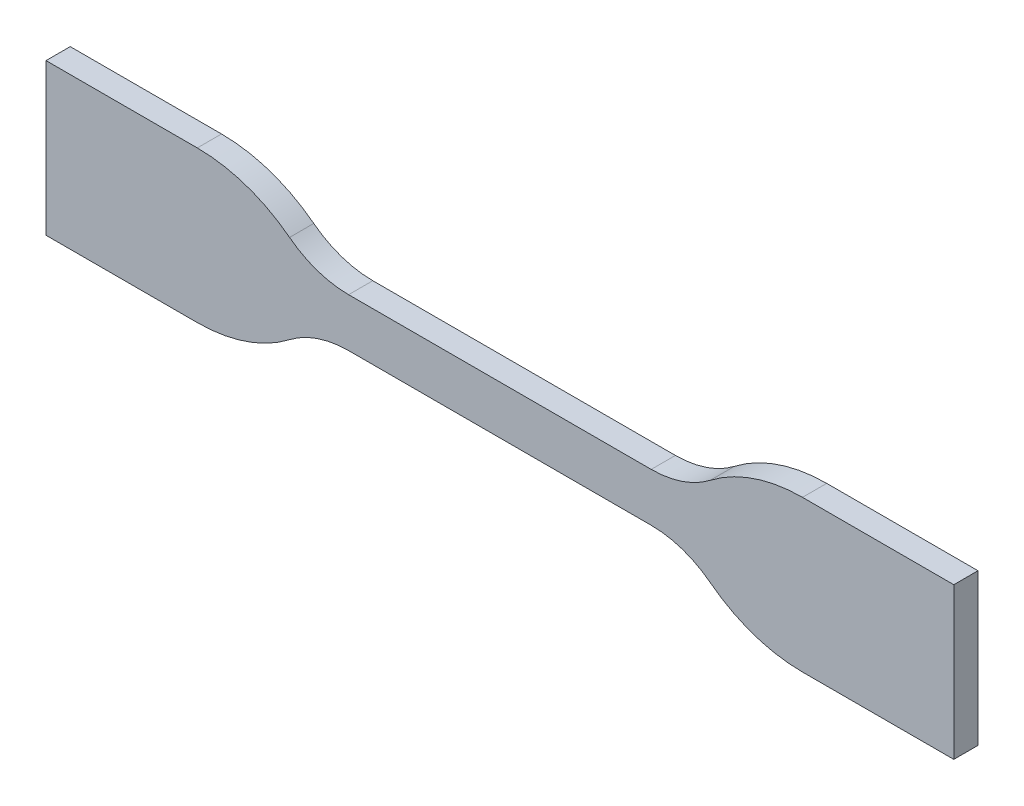
ISO-10303-21;
HEADER;
FILE_DESCRIPTION(('STEP AP214'),'2;1');
FILE_NAME('part.step','',(''),(''),'','','');
FILE_SCHEMA(('AUTOMOTIVE_DESIGN { 1 0 10303 214 1 1 1 1 }'));
ENDSEC;
DATA;
#1=APPLICATION_CONTEXT('core data for automotive mechanical design processes');
#2=APPLICATION_PROTOCOL_DEFINITION('international standard','automotive_design',2000,#1);
#3=PRODUCT_CONTEXT('',#1,'mechanical');
#4=PRODUCT('Part','Part','',(#3));
#5=PRODUCT_RELATED_PRODUCT_CATEGORY('part','',(#4));
#6=PRODUCT_DEFINITION_FORMATION('','',#4);
#7=PRODUCT_DEFINITION_CONTEXT('part definition',#1,'design');
#8=PRODUCT_DEFINITION('design','',#6,#7);
#9=PRODUCT_DEFINITION_SHAPE('','',#8);
#10=(LENGTH_UNIT() NAMED_UNIT(*) SI_UNIT(.MILLI.,.METRE.));
#11=(NAMED_UNIT(*) PLANE_ANGLE_UNIT() SI_UNIT($,.RADIAN.));
#12=(NAMED_UNIT(*) SI_UNIT($,.STERADIAN.) SOLID_ANGLE_UNIT());
#13=UNCERTAINTY_MEASURE_WITH_UNIT(LENGTH_MEASURE(1.E-05),#10,'distance_accuracy_value','');
#14=(GEOMETRIC_REPRESENTATION_CONTEXT(3) GLOBAL_UNCERTAINTY_ASSIGNED_CONTEXT((#13)) GLOBAL_UNIT_ASSIGNED_CONTEXT((#10,
#11,#12)) REPRESENTATION_CONTEXT('',''));
#15=CARTESIAN_POINT('',(0.,0.,0.));
#16=DIRECTION('',(0.,0.,1.));
#17=DIRECTION('',(1.,0.,0.));
#18=AXIS2_PLACEMENT_3D('',#15,#16,#17);
#19=CARTESIAN_POINT('',(12.5,10.0033529411765,2.));
#20=DIRECTION('',(0.,0.,-1.));
#21=DIRECTION('',(-1.,0.,0.));
#22=AXIS2_PLACEMENT_3D('',#19,#20,#21);
#23=CYLINDRICAL_SURFACE('',#22,8.00335294117646);
#24=CARTESIAN_POINT('',(12.5,10.0033529411765,0.));
#25=DIRECTION('',(0.,0.,-1.));
#26=DIRECTION('',(1.,0.,0.));
#27=AXIS2_PLACEMENT_3D('',#24,#25,#26);
#28=CIRCLE('',#27,8.00335294117646);
#29=CARTESIAN_POINT('',(17.3783434922911,3.65863678737899,0.));
#30=VERTEX_POINT('',#29);
#31=CARTESIAN_POINT('',(12.5,1.99999999999999,0.));
#32=VERTEX_POINT('',#31);
#33=EDGE_CURVE('E194',#30,#32,#28,.T.);
#34=ORIENTED_EDGE('',*,*,#33,.T.);
#35=DIRECTION('',(0.,0.,-1.));
#36=VECTOR('',#35,1.);
#37=CARTESIAN_POINT('',(12.5,1.99999999999999,2.));
#38=LINE('',#37,#36);
#39=CARTESIAN_POINT('',(12.5,1.99999999999999,2.));
#40=VERTEX_POINT('',#39);
#41=EDGE_CURVE('E11',#40,#32,#38,.T.);
#42=ORIENTED_EDGE('',*,*,#41,.F.);
#43=CARTESIAN_POINT('',(12.5,10.0033529411765,2.));
#44=DIRECTION('',(0.,0.,-1.));
#45=DIRECTION('',(1.,0.,0.));
#46=AXIS2_PLACEMENT_3D('',#43,#44,#45);
#47=CIRCLE('',#46,8.00335294117646);
#48=CARTESIAN_POINT('',(17.3783434922911,3.65863678737899,2.));
#49=VERTEX_POINT('',#48);
#50=EDGE_CURVE('E240',#49,#40,#47,.T.);
#51=ORIENTED_EDGE('',*,*,#50,.F.);
#52=DIRECTION('',(0.,0.,-1.));
#53=VECTOR('',#52,1.);
#54=CARTESIAN_POINT('',(17.3783434922911,3.65863678737899,2.));
#55=LINE('',#54,#53);
#56=EDGE_CURVE('E190',#49,#30,#55,.T.);
#57=ORIENTED_EDGE('',*,*,#56,.T.);
#58=EDGE_LOOP('',(#34,#42,#51,#57));
#59=FACE_BOUND('',#58,.T.);
#60=ADVANCED_FACE('F44',(#59),#23,.F.);
#61=CARTESIAN_POINT('',(-12.5,2.,2.));
#62=DIRECTION('',(0.,-1.,0.));
#63=DIRECTION('',(1.,0.,0.));
#64=AXIS2_PLACEMENT_3D('',#61,#62,#63);
#65=PLANE('',#64);
#66=DIRECTION('',(-1.,0.,0.));
#67=VECTOR('',#66,1.);
#68=CARTESIAN_POINT('',(-12.5,2.,0.));
#69=LINE('',#68,#67);
#70=CARTESIAN_POINT('',(-12.5,2.,0.));
#71=VERTEX_POINT('',#70);
#72=EDGE_CURVE('E198',#32,#71,#69,.T.);
#73=ORIENTED_EDGE('',*,*,#72,.T.);
#74=DIRECTION('',(0.,0.,-1.));
#75=VECTOR('',#74,1.);
#76=CARTESIAN_POINT('',(-12.5,2.,2.));
#77=LINE('',#76,#75);
#78=CARTESIAN_POINT('',(-12.5,2.,2.));
#79=VERTEX_POINT('',#78);
#80=EDGE_CURVE('E53',#79,#71,#77,.T.);
#81=ORIENTED_EDGE('',*,*,#80,.F.);
#82=DIRECTION('',(-1.,0.,0.));
#83=VECTOR('',#82,1.);
#84=CARTESIAN_POINT('',(-12.5,2.,2.));
#85=LINE('',#84,#83);
#86=EDGE_CURVE('E128',#40,#79,#85,.T.);
#87=ORIENTED_EDGE('',*,*,#86,.F.);
#88=ORIENTED_EDGE('',*,*,#41,.T.);
#89=EDGE_LOOP('',(#73,#81,#87,#88));
#90=FACE_BOUND('',#89,.T.);
#91=ADVANCED_FACE('F373',(#90),#65,.F.);
#92=CARTESIAN_POINT('',(-12.5,10.0033529411765,2.));
#93=DIRECTION('',(0.,0.,-1.));
#94=DIRECTION('',(-1.,0.,0.));
#95=AXIS2_PLACEMENT_3D('',#92,#93,#94);
#96=CYLINDRICAL_SURFACE('',#95,8.00335294117646);
#97=CARTESIAN_POINT('',(-12.5,10.0033529411765,0.));
#98=DIRECTION('',(0.,0.,-1.));
#99=DIRECTION('',(-1.,0.,0.));
#100=AXIS2_PLACEMENT_3D('',#97,#98,#99);
#101=CIRCLE('',#100,8.00335294117646);
#102=CARTESIAN_POINT('',(-17.3783434922911,3.65863678737899,0.));
#103=VERTEX_POINT('',#102);
#104=EDGE_CURVE('E201',#71,#103,#101,.T.);
#105=ORIENTED_EDGE('',*,*,#104,.T.);
#106=DIRECTION('',(0.,0.,-1.));
#107=VECTOR('',#106,1.);
#108=CARTESIAN_POINT('',(-17.3783434922911,3.65863678737899,2.));
#109=LINE('',#108,#107);
#110=CARTESIAN_POINT('',(-17.3783434922911,3.65863678737899,2.));
#111=VERTEX_POINT('',#110);
#112=EDGE_CURVE('E283',#111,#103,#109,.T.);
#113=ORIENTED_EDGE('',*,*,#112,.F.);
#114=CARTESIAN_POINT('',(-12.5,10.0033529411765,2.));
#115=DIRECTION('',(0.,0.,-1.));
#116=DIRECTION('',(-1.,0.,0.));
#117=AXIS2_PLACEMENT_3D('',#114,#115,#116);
#118=CIRCLE('',#117,8.00335294117646);
#119=EDGE_CURVE('E294',#79,#111,#118,.T.);
#120=ORIENTED_EDGE('',*,*,#119,.F.);
#121=ORIENTED_EDGE('',*,*,#80,.T.);
#122=EDGE_LOOP('',(#105,#113,#120,#121));
#123=FACE_BOUND('',#122,.T.);
#124=ADVANCED_FACE('F292',(#123),#96,.F.);
#125=CARTESIAN_POINT('',(-25.,-6.254,2.));
#126=DIRECTION('',(0.,0.,-1.));
#127=DIRECTION('',(-1.,0.,0.));
#128=AXIS2_PLACEMENT_3D('',#125,#126,#127);
#129=CYLINDRICAL_SURFACE('',#128,12.504);
#130=CARTESIAN_POINT('',(-25.,-6.254,0.));
#131=DIRECTION('',(0.,0.,1.));
#132=DIRECTION('',(-1.,0.,0.));
#133=AXIS2_PLACEMENT_3D('',#130,#131,#132);
#134=CIRCLE('',#133,12.504);
#135=CARTESIAN_POINT('',(-25.,6.25,0.));
#136=VERTEX_POINT('',#135);
#137=EDGE_CURVE('E204',#103,#136,#134,.T.);
#138=ORIENTED_EDGE('',*,*,#137,.T.);
#139=DIRECTION('',(0.,0.,-1.));
#140=VECTOR('',#139,1.);
#141=CARTESIAN_POINT('',(-25.,6.25,2.));
#142=LINE('',#141,#140);
#143=CARTESIAN_POINT('',(-25.,6.25,2.));
#144=VERTEX_POINT('',#143);
#145=EDGE_CURVE('E279',#144,#136,#142,.T.);
#146=ORIENTED_EDGE('',*,*,#145,.F.);
#147=CARTESIAN_POINT('',(-25.,-6.254,2.));
#148=DIRECTION('',(0.,0.,1.));
#149=DIRECTION('',(-1.,0.,0.));
#150=AXIS2_PLACEMENT_3D('',#147,#148,#149);
#151=CIRCLE('',#150,12.504);
#152=EDGE_CURVE('E313',#111,#144,#151,.T.);
#153=ORIENTED_EDGE('',*,*,#152,.F.);
#154=ORIENTED_EDGE('',*,*,#112,.T.);
#155=EDGE_LOOP('',(#138,#146,#153,#154));
#156=FACE_BOUND('',#155,.T.);
#157=ADVANCED_FACE('F303',(#156),#129,.T.);
#158=CARTESIAN_POINT('',(-25.,6.25,2.));
#159=DIRECTION('',(0.,-1.,0.));
#160=DIRECTION('',(0.,0.,-1.));
#161=AXIS2_PLACEMENT_3D('',#158,#159,#160);
#162=PLANE('',#161);
#163=DIRECTION('',(-1.,0.,0.));
#164=VECTOR('',#163,1.);
#165=CARTESIAN_POINT('',(-25.,6.25,0.));
#166=LINE('',#165,#164);
#167=CARTESIAN_POINT('',(-37.5,6.25,0.));
#168=VERTEX_POINT('',#167);
#169=EDGE_CURVE('E207',#136,#168,#166,.T.);
#170=ORIENTED_EDGE('',*,*,#169,.T.);
#171=DIRECTION('',(0.,0.,-1.));
#172=VECTOR('',#171,1.);
#173=CARTESIAN_POINT('',(-37.5,6.25,2.));
#174=LINE('',#173,#172);
#175=CARTESIAN_POINT('',(-37.5,6.25,2.));
#176=VERTEX_POINT('',#175);
#177=EDGE_CURVE('E275',#176,#168,#174,.T.);
#178=ORIENTED_EDGE('',*,*,#177,.F.);
#179=DIRECTION('',(-1.,0.,0.));
#180=VECTOR('',#179,1.);
#181=CARTESIAN_POINT('',(-25.,6.25,2.));
#182=LINE('',#181,#180);
#183=EDGE_CURVE('E309',#144,#176,#182,.T.);
#184=ORIENTED_EDGE('',*,*,#183,.F.);
#185=ORIENTED_EDGE('',*,*,#145,.T.);
#186=EDGE_LOOP('',(#170,#178,#184,#185));
#187=FACE_BOUND('',#186,.T.);
#188=ADVANCED_FACE('F307',(#187),#162,.F.);
#189=CARTESIAN_POINT('',(-37.5,6.25,2.));
#190=DIRECTION('',(1.,0.,0.));
#191=DIRECTION('',(0.,0.,-1.));
#192=AXIS2_PLACEMENT_3D('',#189,#190,#191);
#193=PLANE('',#192);
#194=DIRECTION('',(0.,-1.,0.));
#195=VECTOR('',#194,1.);
#196=CARTESIAN_POINT('',(-37.5,6.25,0.));
#197=LINE('',#196,#195);
#198=CARTESIAN_POINT('',(-37.5,-6.25,0.));
#199=VERTEX_POINT('',#198);
#200=EDGE_CURVE('E210',#168,#199,#197,.T.);
#201=ORIENTED_EDGE('',*,*,#200,.T.);
#202=DIRECTION('',(0.,0.,-1.));
#203=VECTOR('',#202,1.);
#204=CARTESIAN_POINT('',(-37.5,-6.25,2.));
#205=LINE('',#204,#203);
#206=CARTESIAN_POINT('',(-37.5,-6.25,2.));
#207=VERTEX_POINT('',#206);
#208=EDGE_CURVE('E271',#207,#199,#205,.T.);
#209=ORIENTED_EDGE('',*,*,#208,.F.);
#210=DIRECTION('',(0.,-1.,0.));
#211=VECTOR('',#210,1.);
#212=CARTESIAN_POINT('',(-37.5,6.25,2.));
#213=LINE('',#212,#211);
#214=EDGE_CURVE('E312',#176,#207,#213,.T.);
#215=ORIENTED_EDGE('',*,*,#214,.F.);
#216=ORIENTED_EDGE('',*,*,#177,.T.);
#217=EDGE_LOOP('',(#201,#209,#215,#216));
#218=FACE_BOUND('',#217,.T.);
#219=ADVANCED_FACE('F386',(#218),#193,.F.);
#220=CARTESIAN_POINT('',(-25.,-6.25,2.));
#221=DIRECTION('',(0.,1.,0.));
#222=DIRECTION('',(0.,0.,1.));
#223=AXIS2_PLACEMENT_3D('',#220,#221,#222);
#224=PLANE('',#223);
#225=DIRECTION('',(1.,0.,0.));
#226=VECTOR('',#225,1.);
#227=CARTESIAN_POINT('',(-25.,-6.25,0.));
#228=LINE('',#227,#226);
#229=CARTESIAN_POINT('',(-25.,-6.25,0.));
#230=VERTEX_POINT('',#229);
#231=EDGE_CURVE('E213',#199,#230,#228,.T.);
#232=ORIENTED_EDGE('',*,*,#231,.T.);
#233=DIRECTION('',(0.,0.,-1.));
#234=VECTOR('',#233,1.);
#235=CARTESIAN_POINT('',(-25.,-6.25,2.));
#236=LINE('',#235,#234);
#237=CARTESIAN_POINT('',(-25.,-6.25,2.));
#238=VERTEX_POINT('',#237);
#239=EDGE_CURVE('E267',#238,#230,#236,.T.);
#240=ORIENTED_EDGE('',*,*,#239,.F.);
#241=DIRECTION('',(1.,0.,0.));
#242=VECTOR('',#241,1.);
#243=CARTESIAN_POINT('',(-25.,-6.25,2.));
#244=LINE('',#243,#242);
#245=EDGE_CURVE('E318',#207,#238,#244,.T.);
#246=ORIENTED_EDGE('',*,*,#245,.F.);
#247=ORIENTED_EDGE('',*,*,#208,.T.);
#248=EDGE_LOOP('',(#232,#240,#246,#247));
#249=FACE_BOUND('',#248,.T.);
#250=ADVANCED_FACE('F389',(#249),#224,.F.);
#251=CARTESIAN_POINT('',(-25.,6.254,2.));
#252=DIRECTION('',(0.,0.,-1.));
#253=DIRECTION('',(-1.,0.,0.));
#254=AXIS2_PLACEMENT_3D('',#251,#252,#253);
#255=CYLINDRICAL_SURFACE('',#254,12.504);
#256=CARTESIAN_POINT('',(-25.,6.254,0.));
#257=DIRECTION('',(0.,0.,1.));
#258=DIRECTION('',(1.,0.,0.));
#259=AXIS2_PLACEMENT_3D('',#256,#257,#258);
#260=CIRCLE('',#259,12.504);
#261=CARTESIAN_POINT('',(-17.3783434922911,-3.65863678737899,0.));
#262=VERTEX_POINT('',#261);
#263=EDGE_CURVE('E216',#230,#262,#260,.T.);
#264=ORIENTED_EDGE('',*,*,#263,.T.);
#265=DIRECTION('',(0.,0.,-1.));
#266=VECTOR('',#265,1.);
#267=CARTESIAN_POINT('',(-17.3783434922911,-3.65863678737899,2.));
#268=LINE('',#267,#266);
#269=CARTESIAN_POINT('',(-17.3783434922911,-3.65863678737899,2.));
#270=VERTEX_POINT('',#269);
#271=EDGE_CURVE('E263',#270,#262,#268,.T.);
#272=ORIENTED_EDGE('',*,*,#271,.F.);
#273=CARTESIAN_POINT('',(-25.,6.254,2.));
#274=DIRECTION('',(0.,0.,1.));
#275=DIRECTION('',(1.,0.,0.));
#276=AXIS2_PLACEMENT_3D('',#273,#274,#275);
#277=CIRCLE('',#276,12.504);
#278=EDGE_CURVE('E325',#238,#270,#277,.T.);
#279=ORIENTED_EDGE('',*,*,#278,.F.);
#280=ORIENTED_EDGE('',*,*,#239,.T.);
#281=EDGE_LOOP('',(#264,#272,#279,#280));
#282=FACE_BOUND('',#281,.T.);
#283=ADVANCED_FACE('F393',(#282),#255,.T.);
#284=CARTESIAN_POINT('',(-12.5,-10.0033529411765,2.));
#285=DIRECTION('',(0.,0.,-1.));
#286=DIRECTION('',(-1.,0.,0.));
#287=AXIS2_PLACEMENT_3D('',#284,#285,#286);
#288=CYLINDRICAL_SURFACE('',#287,8.00335294117646);
#289=CARTESIAN_POINT('',(-12.5,-10.0033529411765,0.));
#290=DIRECTION('',(0.,0.,-1.));
#291=DIRECTION('',(1.,0.,0.));
#292=AXIS2_PLACEMENT_3D('',#289,#290,#291);
#293=CIRCLE('',#292,8.00335294117646);
#294=CARTESIAN_POINT('',(-12.5000000000001,-2.,0.));
#295=VERTEX_POINT('',#294);
#296=EDGE_CURVE('E219',#262,#295,#293,.T.);
#297=ORIENTED_EDGE('',*,*,#296,.T.);
#298=DIRECTION('',(0.,0.,-1.));
#299=VECTOR('',#298,1.);
#300=CARTESIAN_POINT('',(-12.5000000000001,-2.,2.));
#301=LINE('',#300,#299);
#302=CARTESIAN_POINT('',(-12.5000000000001,-2.,2.));
#303=VERTEX_POINT('',#302);
#304=EDGE_CURVE('E259',#303,#295,#301,.T.);
#305=ORIENTED_EDGE('',*,*,#304,.F.);
#306=CARTESIAN_POINT('',(-12.5,-10.0033529411765,2.));
#307=DIRECTION('',(0.,0.,-1.));
#308=DIRECTION('',(1.,0.,0.));
#309=AXIS2_PLACEMENT_3D('',#306,#307,#308);
#310=CIRCLE('',#309,8.00335294117646);
#311=EDGE_CURVE('E328',#270,#303,#310,.T.);
#312=ORIENTED_EDGE('',*,*,#311,.F.);
#313=ORIENTED_EDGE('',*,*,#271,.T.);
#314=EDGE_LOOP('',(#297,#305,#312,#313));
#315=FACE_BOUND('',#314,.T.);
#316=ADVANCED_FACE('F397',(#315),#288,.F.);
#317=CARTESIAN_POINT('',(-12.5000000000001,-2.,2.));
#318=DIRECTION('',(0.,1.,0.));
#319=DIRECTION('',(-1.,0.,0.));
#320=AXIS2_PLACEMENT_3D('',#317,#318,#319);
#321=PLANE('',#320);
#322=DIRECTION('',(1.,0.,0.));
#323=VECTOR('',#322,1.);
#324=CARTESIAN_POINT('',(-12.5000000000001,-2.,0.));
#325=LINE('',#324,#323);
#326=CARTESIAN_POINT('',(12.4999999999999,-1.99999999999999,0.));
#327=VERTEX_POINT('',#326);
#328=EDGE_CURVE('E222',#295,#327,#325,.T.);
#329=ORIENTED_EDGE('',*,*,#328,.T.);
#330=DIRECTION('',(0.,0.,-1.));
#331=VECTOR('',#330,1.);
#332=CARTESIAN_POINT('',(12.4999999999999,-1.99999999999999,2.));
#333=LINE('',#332,#331);
#334=CARTESIAN_POINT('',(12.4999999999999,-1.99999999999999,2.));
#335=VERTEX_POINT('',#334);
#336=EDGE_CURVE('E255',#335,#327,#333,.T.);
#337=ORIENTED_EDGE('',*,*,#336,.F.);
#338=DIRECTION('',(1.,0.,0.));
#339=VECTOR('',#338,1.);
#340=CARTESIAN_POINT('',(-12.5000000000001,-2.,2.));
#341=LINE('',#340,#339);
#342=EDGE_CURVE('E331',#303,#335,#341,.T.);
#343=ORIENTED_EDGE('',*,*,#342,.F.);
#344=ORIENTED_EDGE('',*,*,#304,.T.);
#345=EDGE_LOOP('',(#329,#337,#343,#344));
#346=FACE_BOUND('',#345,.T.);
#347=ADVANCED_FACE('F401',(#346),#321,.F.);
#348=CARTESIAN_POINT('',(12.5,-10.0033529411765,2.));
#349=DIRECTION('',(0.,0.,-1.));
#350=DIRECTION('',(-1.,0.,0.));
#351=AXIS2_PLACEMENT_3D('',#348,#349,#350);
#352=CYLINDRICAL_SURFACE('',#351,8.00335294117646);
#353=CARTESIAN_POINT('',(12.5,-10.0033529411765,0.));
#354=DIRECTION('',(0.,0.,-1.));
#355=DIRECTION('',(-1.,0.,0.));
#356=AXIS2_PLACEMENT_3D('',#353,#354,#355);
#357=CIRCLE('',#356,8.00335294117646);
#358=CARTESIAN_POINT('',(17.3783434922911,-3.65863678737899,0.));
#359=VERTEX_POINT('',#358);
#360=EDGE_CURVE('E225',#327,#359,#357,.T.);
#361=ORIENTED_EDGE('',*,*,#360,.T.);
#362=DIRECTION('',(0.,0.,-1.));
#363=VECTOR('',#362,1.);
#364=CARTESIAN_POINT('',(17.3783434922911,-3.65863678737899,2.));
#365=LINE('',#364,#363);
#366=CARTESIAN_POINT('',(17.3783434922911,-3.65863678737899,2.));
#367=VERTEX_POINT('',#366);
#368=EDGE_CURVE('E251',#367,#359,#365,.T.);
#369=ORIENTED_EDGE('',*,*,#368,.F.);
#370=CARTESIAN_POINT('',(12.5,-10.0033529411765,2.));
#371=DIRECTION('',(0.,0.,-1.));
#372=DIRECTION('',(-1.,0.,0.));
#373=AXIS2_PLACEMENT_3D('',#370,#371,#372);
#374=CIRCLE('',#373,8.00335294117646);
#375=EDGE_CURVE('E334',#335,#367,#374,.T.);
#376=ORIENTED_EDGE('',*,*,#375,.F.);
#377=ORIENTED_EDGE('',*,*,#336,.T.);
#378=EDGE_LOOP('',(#361,#369,#376,#377));
#379=FACE_BOUND('',#378,.T.);
#380=ADVANCED_FACE('F405',(#379),#352,.F.);
#381=CARTESIAN_POINT('',(25.,6.254,2.));
#382=DIRECTION('',(0.,0.,-1.));
#383=DIRECTION('',(-1.,0.,0.));
#384=AXIS2_PLACEMENT_3D('',#381,#382,#383);
#385=CYLINDRICAL_SURFACE('',#384,12.504);
#386=CARTESIAN_POINT('',(25.,6.254,0.));
#387=DIRECTION('',(0.,0.,1.));
#388=DIRECTION('',(-1.,0.,0.));
#389=AXIS2_PLACEMENT_3D('',#386,#387,#388);
#390=CIRCLE('',#389,12.504);
#391=CARTESIAN_POINT('',(24.9999999999999,-6.25,0.));
#392=VERTEX_POINT('',#391);
#393=EDGE_CURVE('E228',#359,#392,#390,.T.);
#394=ORIENTED_EDGE('',*,*,#393,.T.);
#395=DIRECTION('',(0.,0.,-1.));
#396=VECTOR('',#395,1.);
#397=CARTESIAN_POINT('',(24.9999999999999,-6.25,2.));
#398=LINE('',#397,#396);
#399=CARTESIAN_POINT('',(24.9999999999999,-6.25,2.));
#400=VERTEX_POINT('',#399);
#401=EDGE_CURVE('E247',#400,#392,#398,.T.);
#402=ORIENTED_EDGE('',*,*,#401,.F.);
#403=CARTESIAN_POINT('',(25.,6.254,2.));
#404=DIRECTION('',(0.,0.,1.));
#405=DIRECTION('',(-1.,0.,0.));
#406=AXIS2_PLACEMENT_3D('',#403,#404,#405);
#407=CIRCLE('',#406,12.504);
#408=EDGE_CURVE('E337',#367,#400,#407,.T.);
#409=ORIENTED_EDGE('',*,*,#408,.F.);
#410=ORIENTED_EDGE('',*,*,#368,.T.);
#411=EDGE_LOOP('',(#394,#402,#409,#410));
#412=FACE_BOUND('',#411,.T.);
#413=ADVANCED_FACE('F354',(#412),#385,.T.);
#414=CARTESIAN_POINT('',(24.9999999999999,-6.25,2.));
#415=DIRECTION('',(0.,1.,0.));
#416=DIRECTION('',(0.,0.,1.));
#417=AXIS2_PLACEMENT_3D('',#414,#415,#416);
#418=PLANE('',#417);
#419=DIRECTION('',(1.,0.,0.));
#420=VECTOR('',#419,1.);
#421=CARTESIAN_POINT('',(24.9999999999999,-6.25,0.));
#422=LINE('',#421,#420);
#423=CARTESIAN_POINT('',(37.5,-6.25,0.));
#424=VERTEX_POINT('',#423);
#425=EDGE_CURVE('E231',#392,#424,#422,.T.);
#426=ORIENTED_EDGE('',*,*,#425,.T.);
#427=DIRECTION('',(0.,0.,-1.));
#428=VECTOR('',#427,1.);
#429=CARTESIAN_POINT('',(37.5,-6.25,2.));
#430=LINE('',#429,#428);
#431=CARTESIAN_POINT('',(37.5,-6.25,2.));
#432=VERTEX_POINT('',#431);
#433=EDGE_CURVE('E182',#432,#424,#430,.T.);
#434=ORIENTED_EDGE('',*,*,#433,.F.);
#435=DIRECTION('',(1.,0.,0.));
#436=VECTOR('',#435,1.);
#437=CARTESIAN_POINT('',(24.9999999999999,-6.25,2.));
#438=LINE('',#437,#436);
#439=EDGE_CURVE('E171',#400,#432,#438,.T.);
#440=ORIENTED_EDGE('',*,*,#439,.F.);
#441=ORIENTED_EDGE('',*,*,#401,.T.);
#442=EDGE_LOOP('',(#426,#434,#440,#441));
#443=FACE_BOUND('',#442,.T.);
#444=ADVANCED_FACE('F358',(#443),#418,.F.);
#445=CARTESIAN_POINT('',(37.5,6.25,2.));
#446=DIRECTION('',(-1.,0.,0.));
#447=DIRECTION('',(0.,0.,1.));
#448=AXIS2_PLACEMENT_3D('',#445,#446,#447);
#449=PLANE('',#448);
#450=DIRECTION('',(0.,1.,0.));
#451=VECTOR('',#450,1.);
#452=CARTESIAN_POINT('',(37.5,6.25,0.));
#453=LINE('',#452,#451);
#454=CARTESIAN_POINT('',(37.5,6.25,0.));
#455=VERTEX_POINT('',#454);
#456=EDGE_CURVE('E180',#424,#455,#453,.T.);
#457=ORIENTED_EDGE('',*,*,#456,.T.);
#458=DIRECTION('',(0.,0.,-1.));
#459=VECTOR('',#458,1.);
#460=CARTESIAN_POINT('',(37.5,6.25,2.));
#461=LINE('',#460,#459);
#462=CARTESIAN_POINT('',(37.5,6.25,2.));
#463=VERTEX_POINT('',#462);
#464=EDGE_CURVE('E177',#463,#455,#461,.T.);
#465=ORIENTED_EDGE('',*,*,#464,.F.);
#466=DIRECTION('',(0.,1.,0.));
#467=VECTOR('',#466,1.);
#468=CARTESIAN_POINT('',(37.5,6.25,2.));
#469=LINE('',#468,#467);
#470=EDGE_CURVE('E165',#432,#463,#469,.T.);
#471=ORIENTED_EDGE('',*,*,#470,.F.);
#472=ORIENTED_EDGE('',*,*,#433,.T.);
#473=EDGE_LOOP('',(#457,#465,#471,#472));
#474=FACE_BOUND('',#473,.T.);
#475=ADVANCED_FACE('F178',(#474),#449,.F.);
#476=CARTESIAN_POINT('',(25.,6.25,2.));
#477=DIRECTION('',(0.,-1.,0.));
#478=DIRECTION('',(0.,0.,-1.));
#479=AXIS2_PLACEMENT_3D('',#476,#477,#478);
#480=PLANE('',#479);
#481=DIRECTION('',(-1.,0.,0.));
#482=VECTOR('',#481,1.);
#483=CARTESIAN_POINT('',(25.,6.25,0.));
#484=LINE('',#483,#482);
#485=CARTESIAN_POINT('',(25.,6.25,0.));
#486=VERTEX_POINT('',#485);
#487=EDGE_CURVE('E114',#455,#486,#484,.T.);
#488=ORIENTED_EDGE('',*,*,#487,.T.);
#489=DIRECTION('',(0.,0.,-1.));
#490=VECTOR('',#489,1.);
#491=CARTESIAN_POINT('',(25.,6.25,2.));
#492=LINE('',#491,#490);
#493=CARTESIAN_POINT('',(25.,6.25,2.));
#494=VERTEX_POINT('',#493);
#495=EDGE_CURVE('E183',#494,#486,#492,.T.);
#496=ORIENTED_EDGE('',*,*,#495,.F.);
#497=DIRECTION('',(-1.,0.,0.));
#498=VECTOR('',#497,1.);
#499=CARTESIAN_POINT('',(25.,6.25,2.));
#500=LINE('',#499,#498);
#501=EDGE_CURVE('E169',#463,#494,#500,.T.);
#502=ORIENTED_EDGE('',*,*,#501,.F.);
#503=ORIENTED_EDGE('',*,*,#464,.T.);
#504=EDGE_LOOP('',(#488,#496,#502,#503));
#505=FACE_BOUND('',#504,.T.);
#506=ADVANCED_FACE('F185',(#505),#480,.F.);
#507=CARTESIAN_POINT('',(25.,-6.254,2.));
#508=DIRECTION('',(0.,0.,-1.));
#509=DIRECTION('',(-1.,0.,0.));
#510=AXIS2_PLACEMENT_3D('',#507,#508,#509);
#511=CYLINDRICAL_SURFACE('',#510,12.504);
#512=CARTESIAN_POINT('',(25.,-6.254,0.));
#513=DIRECTION('',(0.,0.,1.));
#514=DIRECTION('',(1.,0.,0.));
#515=AXIS2_PLACEMENT_3D('',#512,#513,#514);
#516=CIRCLE('',#515,12.504);
#517=EDGE_CURVE('E120',#486,#30,#516,.T.);
#518=ORIENTED_EDGE('',*,*,#517,.T.);
#519=ORIENTED_EDGE('',*,*,#56,.F.);
#520=CARTESIAN_POINT('',(25.,-6.254,2.));
#521=DIRECTION('',(0.,0.,1.));
#522=DIRECTION('',(1.,0.,0.));
#523=AXIS2_PLACEMENT_3D('',#520,#521,#522);
#524=CIRCLE('',#523,12.504);
#525=EDGE_CURVE('E61',#494,#49,#524,.T.);
#526=ORIENTED_EDGE('',*,*,#525,.F.);
#527=ORIENTED_EDGE('',*,*,#495,.T.);
#528=EDGE_LOOP('',(#518,#519,#526,#527));
#529=FACE_BOUND('',#528,.T.);
#530=ADVANCED_FACE('F362',(#529),#511,.T.);
#531=CARTESIAN_POINT('',(12.5,10.0033529411765,2.));
#532=DIRECTION('',(0.,0.,1.));
#533=DIRECTION('',(1.,0.,0.));
#534=AXIS2_PLACEMENT_3D('',#531,#532,#533);
#535=PLANE('',#534);
#536=ORIENTED_EDGE('',*,*,#50,.T.);
#537=ORIENTED_EDGE('',*,*,#86,.T.);
#538=ORIENTED_EDGE('',*,*,#119,.T.);
#539=ORIENTED_EDGE('',*,*,#152,.T.);
#540=ORIENTED_EDGE('',*,*,#183,.T.);
#541=ORIENTED_EDGE('',*,*,#214,.T.);
#542=ORIENTED_EDGE('',*,*,#245,.T.);
#543=ORIENTED_EDGE('',*,*,#278,.T.);
#544=ORIENTED_EDGE('',*,*,#311,.T.);
#545=ORIENTED_EDGE('',*,*,#342,.T.);
#546=ORIENTED_EDGE('',*,*,#375,.T.);
#547=ORIENTED_EDGE('',*,*,#408,.T.);
#548=ORIENTED_EDGE('',*,*,#439,.T.);
#549=ORIENTED_EDGE('',*,*,#470,.T.);
#550=ORIENTED_EDGE('',*,*,#501,.T.);
#551=ORIENTED_EDGE('',*,*,#525,.T.);
#552=EDGE_LOOP('',(#536,#537,#538,#539,#540,#541,#542,#543,#544,#545,#546,#547,#548,#549,#550,#551));
#553=FACE_BOUND('',#552,.T.);
#554=ADVANCED_FACE('F167',(#553),#535,.T.);
#555=CARTESIAN_POINT('',(12.5,10.0033529411765,0.));
#556=DIRECTION('',(0.,0.,1.));
#557=DIRECTION('',(1.,0.,0.));
#558=AXIS2_PLACEMENT_3D('',#555,#556,#557);
#559=PLANE('',#558);
#560=ORIENTED_EDGE('',*,*,#33,.F.);
#561=ORIENTED_EDGE('',*,*,#517,.F.);
#562=ORIENTED_EDGE('',*,*,#487,.F.);
#563=ORIENTED_EDGE('',*,*,#456,.F.);
#564=ORIENTED_EDGE('',*,*,#425,.F.);
#565=ORIENTED_EDGE('',*,*,#393,.F.);
#566=ORIENTED_EDGE('',*,*,#360,.F.);
#567=ORIENTED_EDGE('',*,*,#328,.F.);
#568=ORIENTED_EDGE('',*,*,#296,.F.);
#569=ORIENTED_EDGE('',*,*,#263,.F.);
#570=ORIENTED_EDGE('',*,*,#231,.F.);
#571=ORIENTED_EDGE('',*,*,#200,.F.);
#572=ORIENTED_EDGE('',*,*,#169,.F.);
#573=ORIENTED_EDGE('',*,*,#137,.F.);
#574=ORIENTED_EDGE('',*,*,#104,.F.);
#575=ORIENTED_EDGE('',*,*,#72,.F.);
#576=EDGE_LOOP('',(#560,#561,#562,#563,#564,#565,#566,#567,#568,#569,#570,#571,#572,#573,#574,#575));
#577=FACE_BOUND('',#576,.T.);
#578=ADVANCED_FACE('F298',(#577),#559,.F.);
#579=CLOSED_SHELL('',(#60,#91,#124,#157,#188,#219,#250,#283,#316,#347,#380,#413,#444,#475,#506,
#530,#554,#578));
#580=MANIFOLD_SOLID_BREP('B2',#579);
#581=ADVANCED_BREP_SHAPE_REPRESENTATION('',(#18,#580),#14);
#582=SHAPE_DEFINITION_REPRESENTATION(#9,#581);
ENDSEC;
END-ISO-10303-21;
